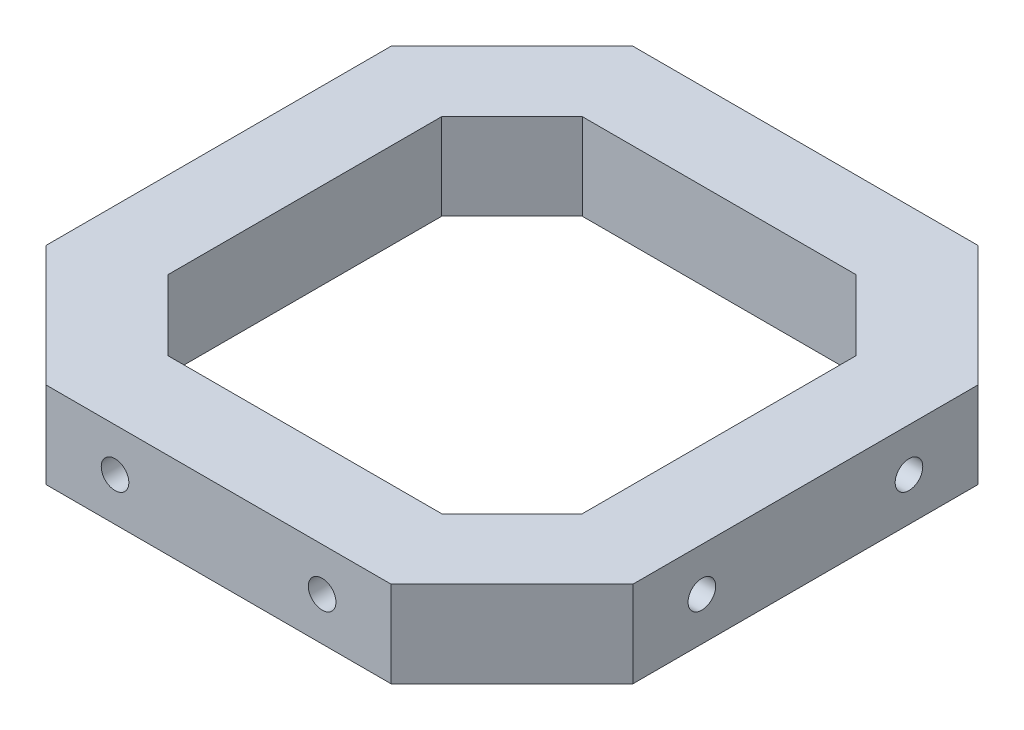
ISO-10303-21;
HEADER;
FILE_DESCRIPTION(('STEP AP214'),'2;1');
FILE_NAME('part.step','',(''),(''),'','','');
FILE_SCHEMA(('AUTOMOTIVE_DESIGN { 1 0 10303 214 1 1 1 1 }'));
ENDSEC;
DATA;
#1=APPLICATION_CONTEXT('core data for automotive mechanical design processes');
#2=APPLICATION_PROTOCOL_DEFINITION('international standard','automotive_design',2000,#1);
#3=PRODUCT_CONTEXT('',#1,'mechanical');
#4=PRODUCT('Part','Part','',(#3));
#5=PRODUCT_RELATED_PRODUCT_CATEGORY('part','',(#4));
#6=PRODUCT_DEFINITION_FORMATION('','',#4);
#7=PRODUCT_DEFINITION_CONTEXT('part definition',#1,'design');
#8=PRODUCT_DEFINITION('design','',#6,#7);
#9=PRODUCT_DEFINITION_SHAPE('','',#8);
#10=(LENGTH_UNIT() NAMED_UNIT(*) SI_UNIT(.MILLI.,.METRE.));
#11=(NAMED_UNIT(*) PLANE_ANGLE_UNIT() SI_UNIT($,.RADIAN.));
#12=(NAMED_UNIT(*) SI_UNIT($,.STERADIAN.) SOLID_ANGLE_UNIT());
#13=UNCERTAINTY_MEASURE_WITH_UNIT(LENGTH_MEASURE(1.E-05),#10,'distance_accuracy_value','');
#14=(GEOMETRIC_REPRESENTATION_CONTEXT(3) GLOBAL_UNCERTAINTY_ASSIGNED_CONTEXT((#13)) GLOBAL_UNIT_ASSIGNED_CONTEXT((#10,
#11,#12)) REPRESENTATION_CONTEXT('',''));
#15=CARTESIAN_POINT('',(0.,0.,0.));
#16=DIRECTION('',(0.,0.,1.));
#17=DIRECTION('',(1.,0.,0.));
#18=AXIS2_PLACEMENT_3D('',#15,#16,#17);
#19=CARTESIAN_POINT('',(0.,5.,0.));
#20=DIRECTION('',(0.,1.,0.));
#21=DIRECTION('',(0.,0.,1.));
#22=AXIS2_PLACEMENT_3D('',#19,#20,#21);
#23=PLANE('',#22);
#24=DIRECTION('',(0.,0.,1.));
#25=VECTOR('',#24,1.);
#26=CARTESIAN_POINT('',(17.,5.,-10.));
#27=LINE('',#26,#25);
#28=CARTESIAN_POINT('',(17.,5.,-10.));
#29=VERTEX_POINT('',#28);
#30=CARTESIAN_POINT('',(17.,5.,10.));
#31=VERTEX_POINT('',#30);
#32=EDGE_CURVE('E264',#29,#31,#27,.T.);
#33=ORIENTED_EDGE('',*,*,#32,.F.);
#34=DIRECTION('',(-0.707106781186547,0.,-0.707106781186548));
#35=VECTOR('',#34,1.);
#36=CARTESIAN_POINT('',(17.,5.,-10.));
#37=LINE('',#36,#35);
#38=CARTESIAN_POINT('',(10.,5.,-17.));
#39=VERTEX_POINT('',#38);
#40=EDGE_CURVE('E281',#29,#39,#37,.T.);
#41=ORIENTED_EDGE('',*,*,#40,.T.);
#42=DIRECTION('',(-1.,0.,0.));
#43=VECTOR('',#42,1.);
#44=CARTESIAN_POINT('',(10.,5.,-17.));
#45=LINE('',#44,#43);
#46=CARTESIAN_POINT('',(-10.,5.,-17.));
#47=VERTEX_POINT('',#46);
#48=EDGE_CURVE('E279',#39,#47,#45,.T.);
#49=ORIENTED_EDGE('',*,*,#48,.T.);
#50=DIRECTION('',(-0.707106781186547,0.,0.707106781186547));
#51=VECTOR('',#50,1.);
#52=CARTESIAN_POINT('',(-10.,5.,-17.));
#53=LINE('',#52,#51);
#54=CARTESIAN_POINT('',(-17.,5.,-10.));
#55=VERTEX_POINT('',#54);
#56=EDGE_CURVE('E277',#47,#55,#53,.T.);
#57=ORIENTED_EDGE('',*,*,#56,.T.);
#58=DIRECTION('',(0.,0.,1.));
#59=VECTOR('',#58,1.);
#60=CARTESIAN_POINT('',(-17.,5.,-10.));
#61=LINE('',#60,#59);
#62=CARTESIAN_POINT('',(-17.,5.,10.));
#63=VERTEX_POINT('',#62);
#64=EDGE_CURVE('E275',#55,#63,#61,.T.);
#65=ORIENTED_EDGE('',*,*,#64,.T.);
#66=DIRECTION('',(0.707106781186547,0.,0.707106781186547));
#67=VECTOR('',#66,1.);
#68=CARTESIAN_POINT('',(-17.,5.,10.));
#69=LINE('',#68,#67);
#70=CARTESIAN_POINT('',(-10.,5.,17.));
#71=VERTEX_POINT('',#70);
#72=EDGE_CURVE('E273',#63,#71,#69,.T.);
#73=ORIENTED_EDGE('',*,*,#72,.T.);
#74=DIRECTION('',(1.,0.,0.));
#75=VECTOR('',#74,1.);
#76=CARTESIAN_POINT('',(-10.,5.,17.));
#77=LINE('',#76,#75);
#78=CARTESIAN_POINT('',(10.,5.,17.));
#79=VERTEX_POINT('',#78);
#80=EDGE_CURVE('E271',#71,#79,#77,.T.);
#81=ORIENTED_EDGE('',*,*,#80,.T.);
#82=DIRECTION('',(-0.707106781186547,0.,0.707106781186548));
#83=VECTOR('',#82,1.);
#84=CARTESIAN_POINT('',(17.,5.,10.));
#85=LINE('',#84,#83);
#86=EDGE_CURVE('E267',#31,#79,#85,.T.);
#87=ORIENTED_EDGE('',*,*,#86,.F.);
#88=EDGE_LOOP('',(#33,#41,#49,#57,#65,#73,#81,#87));
#89=FACE_BOUND('',#88,.T.);
#90=DIRECTION('',(1.,0.,0.));
#91=VECTOR('',#90,1.);
#92=CARTESIAN_POINT('',(-7.92893218813452,5.,12.));
#93=LINE('',#92,#91);
#94=CARTESIAN_POINT('',(-7.92893218813452,5.,12.));
#95=VERTEX_POINT('',#94);
#96=CARTESIAN_POINT('',(7.9289321881345,5.,12.));
#97=VERTEX_POINT('',#96);
#98=EDGE_CURVE('E205',#95,#97,#93,.T.);
#99=ORIENTED_EDGE('',*,*,#98,.F.);
#100=DIRECTION('',(0.707106781186546,0.,0.707106781186549));
#101=VECTOR('',#100,1.);
#102=CARTESIAN_POINT('',(-12.,5.,7.92893218813448));
#103=LINE('',#102,#101);
#104=CARTESIAN_POINT('',(-12.,5.,7.92893218813448));
#105=VERTEX_POINT('',#104);
#106=EDGE_CURVE('E197',#105,#95,#103,.T.);
#107=ORIENTED_EDGE('',*,*,#106,.F.);
#108=DIRECTION('',(0.,0.,1.));
#109=VECTOR('',#108,1.);
#110=CARTESIAN_POINT('',(-12.,5.,-7.92893218813449));
#111=LINE('',#110,#109);
#112=CARTESIAN_POINT('',(-12.,5.,-7.92893218813449));
#113=VERTEX_POINT('',#112);
#114=EDGE_CURVE('E231',#113,#105,#111,.T.);
#115=ORIENTED_EDGE('',*,*,#114,.F.);
#116=DIRECTION('',(-0.707106781186544,0.,0.707106781186551));
#117=VECTOR('',#116,1.);
#118=CARTESIAN_POINT('',(-7.92893218813455,5.,-12.));
#119=LINE('',#118,#117);
#120=CARTESIAN_POINT('',(-7.92893218813455,5.,-12.));
#121=VERTEX_POINT('',#120);
#122=EDGE_CURVE('E229',#121,#113,#119,.T.);
#123=ORIENTED_EDGE('',*,*,#122,.F.);
#124=DIRECTION('',(-1.,0.,0.));
#125=VECTOR('',#124,1.);
#126=CARTESIAN_POINT('',(7.92893218813451,5.,-12.));
#127=LINE('',#126,#125);
#128=CARTESIAN_POINT('',(7.92893218813451,5.,-12.));
#129=VERTEX_POINT('',#128);
#130=EDGE_CURVE('E227',#129,#121,#127,.T.);
#131=ORIENTED_EDGE('',*,*,#130,.F.);
#132=DIRECTION('',(-0.707106781186546,0.,-0.707106781186549));
#133=VECTOR('',#132,1.);
#134=CARTESIAN_POINT('',(12.,5.,-7.92893218813449));
#135=LINE('',#134,#133);
#136=CARTESIAN_POINT('',(12.,5.,-7.92893218813449));
#137=VERTEX_POINT('',#136);
#138=EDGE_CURVE('E225',#137,#129,#135,.T.);
#139=ORIENTED_EDGE('',*,*,#138,.F.);
#140=DIRECTION('',(0.,0.,-1.));
#141=VECTOR('',#140,1.);
#142=CARTESIAN_POINT('',(12.,5.,7.92893218813451));
#143=LINE('',#142,#141);
#144=CARTESIAN_POINT('',(12.,5.,7.92893218813451));
#145=VERTEX_POINT('',#144);
#146=EDGE_CURVE('E220',#145,#137,#143,.T.);
#147=ORIENTED_EDGE('',*,*,#146,.F.);
#148=DIRECTION('',(0.707106781186548,0.,-0.707106781186547));
#149=VECTOR('',#148,1.);
#150=CARTESIAN_POINT('',(7.9289321881345,5.,12.));
#151=LINE('',#150,#149);
#152=EDGE_CURVE('E218',#97,#145,#151,.T.);
#153=ORIENTED_EDGE('',*,*,#152,.F.);
#154=EDGE_LOOP('',(#99,#107,#115,#123,#131,#139,#147,#153));
#155=FACE_BOUND('',#154,.T.);
#156=ADVANCED_FACE('F83',(#89,#155),#23,.T.);
#157=CARTESIAN_POINT('',(0.,0.,0.));
#158=DIRECTION('',(0.,1.,0.));
#159=DIRECTION('',(0.,0.,1.));
#160=AXIS2_PLACEMENT_3D('',#157,#158,#159);
#161=PLANE('',#160);
#162=DIRECTION('',(0.,0.,1.));
#163=VECTOR('',#162,1.);
#164=CARTESIAN_POINT('',(17.,0.,-10.));
#165=LINE('',#164,#163);
#166=CARTESIAN_POINT('',(17.,0.,-10.));
#167=VERTEX_POINT('',#166);
#168=CARTESIAN_POINT('',(17.,0.,10.));
#169=VERTEX_POINT('',#168);
#170=EDGE_CURVE('E213',#167,#169,#165,.T.);
#171=ORIENTED_EDGE('',*,*,#170,.T.);
#172=DIRECTION('',(-0.707106781186547,0.,0.707106781186548));
#173=VECTOR('',#172,1.);
#174=CARTESIAN_POINT('',(17.,0.,10.));
#175=LINE('',#174,#173);
#176=CARTESIAN_POINT('',(10.,0.,17.));
#177=VERTEX_POINT('',#176);
#178=EDGE_CURVE('E285',#169,#177,#175,.T.);
#179=ORIENTED_EDGE('',*,*,#178,.T.);
#180=DIRECTION('',(1.,0.,0.));
#181=VECTOR('',#180,1.);
#182=CARTESIAN_POINT('',(-10.,0.,17.));
#183=LINE('',#182,#181);
#184=CARTESIAN_POINT('',(-10.,0.,17.));
#185=VERTEX_POINT('',#184);
#186=EDGE_CURVE('E288',#185,#177,#183,.T.);
#187=ORIENTED_EDGE('',*,*,#186,.F.);
#188=DIRECTION('',(0.707106781186547,0.,0.707106781186547));
#189=VECTOR('',#188,1.);
#190=CARTESIAN_POINT('',(-17.,0.,10.));
#191=LINE('',#190,#189);
#192=CARTESIAN_POINT('',(-17.,0.,10.));
#193=VERTEX_POINT('',#192);
#194=EDGE_CURVE('E291',#193,#185,#191,.T.);
#195=ORIENTED_EDGE('',*,*,#194,.F.);
#196=DIRECTION('',(0.,0.,1.));
#197=VECTOR('',#196,1.);
#198=CARTESIAN_POINT('',(-17.,0.,-10.));
#199=LINE('',#198,#197);
#200=CARTESIAN_POINT('',(-17.,0.,-10.));
#201=VERTEX_POINT('',#200);
#202=EDGE_CURVE('E293',#201,#193,#199,.T.);
#203=ORIENTED_EDGE('',*,*,#202,.F.);
#204=DIRECTION('',(-0.707106781186547,0.,0.707106781186547));
#205=VECTOR('',#204,1.);
#206=CARTESIAN_POINT('',(-10.,0.,-17.));
#207=LINE('',#206,#205);
#208=CARTESIAN_POINT('',(-10.,0.,-17.));
#209=VERTEX_POINT('',#208);
#210=EDGE_CURVE('E295',#209,#201,#207,.T.);
#211=ORIENTED_EDGE('',*,*,#210,.F.);
#212=DIRECTION('',(-1.,0.,0.));
#213=VECTOR('',#212,1.);
#214=CARTESIAN_POINT('',(10.,0.,-17.));
#215=LINE('',#214,#213);
#216=CARTESIAN_POINT('',(10.,0.,-17.));
#217=VERTEX_POINT('',#216);
#218=EDGE_CURVE('E297',#217,#209,#215,.T.);
#219=ORIENTED_EDGE('',*,*,#218,.F.);
#220=DIRECTION('',(-0.707106781186547,0.,-0.707106781186548));
#221=VECTOR('',#220,1.);
#222=CARTESIAN_POINT('',(17.,0.,-10.));
#223=LINE('',#222,#221);
#224=EDGE_CURVE('E268',#167,#217,#223,.T.);
#225=ORIENTED_EDGE('',*,*,#224,.F.);
#226=EDGE_LOOP('',(#171,#179,#187,#195,#203,#211,#219,#225));
#227=FACE_BOUND('',#226,.T.);
#228=DIRECTION('',(0.707106781186546,0.,0.707106781186549));
#229=VECTOR('',#228,1.);
#230=CARTESIAN_POINT('',(-12.,0.,7.92893218813448));
#231=LINE('',#230,#229);
#232=CARTESIAN_POINT('',(-12.,0.,7.92893218813448));
#233=VERTEX_POINT('',#232);
#234=CARTESIAN_POINT('',(-7.92893218813452,0.,12.));
#235=VERTEX_POINT('',#234);
#236=EDGE_CURVE('E108',#233,#235,#231,.T.);
#237=ORIENTED_EDGE('',*,*,#236,.T.);
#238=DIRECTION('',(1.,0.,0.));
#239=VECTOR('',#238,1.);
#240=CARTESIAN_POINT('',(-7.92893218813452,0.,12.));
#241=LINE('',#240,#239);
#242=CARTESIAN_POINT('',(7.9289321881345,0.,12.));
#243=VERTEX_POINT('',#242);
#244=EDGE_CURVE('E212',#235,#243,#241,.T.);
#245=ORIENTED_EDGE('',*,*,#244,.T.);
#246=DIRECTION('',(0.707106781186548,0.,-0.707106781186547));
#247=VECTOR('',#246,1.);
#248=CARTESIAN_POINT('',(7.9289321881345,0.,12.));
#249=LINE('',#248,#247);
#250=CARTESIAN_POINT('',(12.,0.,7.92893218813451));
#251=VERTEX_POINT('',#250);
#252=EDGE_CURVE('E236',#243,#251,#249,.T.);
#253=ORIENTED_EDGE('',*,*,#252,.T.);
#254=DIRECTION('',(0.,0.,-1.));
#255=VECTOR('',#254,1.);
#256=CARTESIAN_POINT('',(12.,0.,7.92893218813451));
#257=LINE('',#256,#255);
#258=CARTESIAN_POINT('',(12.,0.,-7.92893218813449));
#259=VERTEX_POINT('',#258);
#260=EDGE_CURVE('E239',#251,#259,#257,.T.);
#261=ORIENTED_EDGE('',*,*,#260,.T.);
#262=DIRECTION('',(-0.707106781186546,0.,-0.707106781186549));
#263=VECTOR('',#262,1.);
#264=CARTESIAN_POINT('',(12.,0.,-7.92893218813449));
#265=LINE('',#264,#263);
#266=CARTESIAN_POINT('',(7.92893218813451,0.,-12.));
#267=VERTEX_POINT('',#266);
#268=EDGE_CURVE('E242',#259,#267,#265,.T.);
#269=ORIENTED_EDGE('',*,*,#268,.T.);
#270=DIRECTION('',(-1.,0.,0.));
#271=VECTOR('',#270,1.);
#272=CARTESIAN_POINT('',(7.92893218813451,0.,-12.));
#273=LINE('',#272,#271);
#274=CARTESIAN_POINT('',(-7.92893218813455,0.,-12.));
#275=VERTEX_POINT('',#274);
#276=EDGE_CURVE('E245',#267,#275,#273,.T.);
#277=ORIENTED_EDGE('',*,*,#276,.T.);
#278=DIRECTION('',(-0.707106781186544,0.,0.707106781186551));
#279=VECTOR('',#278,1.);
#280=CARTESIAN_POINT('',(-7.92893218813455,0.,-12.));
#281=LINE('',#280,#279);
#282=CARTESIAN_POINT('',(-12.,0.,-7.92893218813449));
#283=VERTEX_POINT('',#282);
#284=EDGE_CURVE('E248',#275,#283,#281,.T.);
#285=ORIENTED_EDGE('',*,*,#284,.T.);
#286=DIRECTION('',(0.,0.,1.));
#287=VECTOR('',#286,1.);
#288=CARTESIAN_POINT('',(-12.,0.,-7.92893218813449));
#289=LINE('',#288,#287);
#290=EDGE_CURVE('E206',#283,#233,#289,.T.);
#291=ORIENTED_EDGE('',*,*,#290,.T.);
#292=EDGE_LOOP('',(#237,#245,#253,#261,#269,#277,#285,#291));
#293=FACE_BOUND('',#292,.T.);
#294=ADVANCED_FACE('F325',(#227,#293),#161,.F.);
#295=CARTESIAN_POINT('',(17.,5.,-10.));
#296=DIRECTION('',(1.,0.,0.));
#297=DIRECTION('',(0.,0.,-1.));
#298=AXIS2_PLACEMENT_3D('',#295,#296,#297);
#299=PLANE('',#298);
#300=CARTESIAN_POINT('',(17.,2.5,-6.));
#301=DIRECTION('',(1.,0.,0.));
#302=DIRECTION('',(0.,0.,-1.));
#303=AXIS2_PLACEMENT_3D('',#300,#301,#302);
#304=CIRCLE('',#303,0.800000000000001);
#305=CARTESIAN_POINT('',(17.,2.5,-6.8));
#306=VERTEX_POINT('',#305);
#307=EDGE_CURVE('E384',#306,#306,#304,.T.);
#308=ORIENTED_EDGE('',*,*,#307,.F.);
#309=EDGE_LOOP('',(#308));
#310=FACE_BOUND('',#309,.T.);
#311=CARTESIAN_POINT('',(17.,2.5,6.));
#312=DIRECTION('',(1.,0.,0.));
#313=DIRECTION('',(0.,0.,-1.));
#314=AXIS2_PLACEMENT_3D('',#311,#312,#313);
#315=CIRCLE('',#314,0.800000000000001);
#316=CARTESIAN_POINT('',(17.,2.5,5.2));
#317=VERTEX_POINT('',#316);
#318=EDGE_CURVE('E387',#317,#317,#315,.T.);
#319=ORIENTED_EDGE('',*,*,#318,.F.);
#320=EDGE_LOOP('',(#319));
#321=FACE_BOUND('',#320,.T.);
#322=ORIENTED_EDGE('',*,*,#170,.F.);
#323=DIRECTION('',(0.,-1.,0.));
#324=VECTOR('',#323,1.);
#325=CARTESIAN_POINT('',(17.,5.,-10.));
#326=LINE('',#325,#324);
#327=EDGE_CURVE('E12',#29,#167,#326,.T.);
#328=ORIENTED_EDGE('',*,*,#327,.F.);
#329=ORIENTED_EDGE('',*,*,#32,.T.);
#330=DIRECTION('',(0.,-1.,0.));
#331=VECTOR('',#330,1.);
#332=CARTESIAN_POINT('',(17.,5.,10.));
#333=LINE('',#332,#331);
#334=EDGE_CURVE('E87',#31,#169,#333,.T.);
#335=ORIENTED_EDGE('',*,*,#334,.T.);
#336=EDGE_LOOP('',(#322,#328,#329,#335));
#337=FACE_BOUND('',#336,.T.);
#338=ADVANCED_FACE('F85',(#310,#321,#337),#299,.T.);
#339=CARTESIAN_POINT('',(17.,5.,-10.));
#340=DIRECTION('',(-0.707106781186548,0.,0.707106781186547));
#341=DIRECTION('',(0.707106781186547,0.,0.707106781186548));
#342=AXIS2_PLACEMENT_3D('',#339,#340,#341);
#343=PLANE('',#342);
#344=ORIENTED_EDGE('',*,*,#224,.T.);
#345=DIRECTION('',(0.,-1.,0.));
#346=VECTOR('',#345,1.);
#347=CARTESIAN_POINT('',(10.,5.,-17.));
#348=LINE('',#347,#346);
#349=EDGE_CURVE('E92',#39,#217,#348,.T.);
#350=ORIENTED_EDGE('',*,*,#349,.F.);
#351=ORIENTED_EDGE('',*,*,#40,.F.);
#352=ORIENTED_EDGE('',*,*,#327,.T.);
#353=EDGE_LOOP('',(#344,#350,#351,#352));
#354=FACE_BOUND('',#353,.T.);
#355=ADVANCED_FACE('F331',(#354),#343,.F.);
#356=CARTESIAN_POINT('',(10.,5.,-17.));
#357=DIRECTION('',(0.,0.,1.));
#358=DIRECTION('',(1.,0.,0.));
#359=AXIS2_PLACEMENT_3D('',#356,#357,#358);
#360=PLANE('',#359);
#361=CARTESIAN_POINT('',(-6.,2.5,-17.));
#362=DIRECTION('',(0.,0.,-1.));
#363=DIRECTION('',(-1.,0.,0.));
#364=AXIS2_PLACEMENT_3D('',#361,#362,#363);
#365=CIRCLE('',#364,0.800000000000001);
#366=CARTESIAN_POINT('',(-6.8,2.5,-17.));
#367=VERTEX_POINT('',#366);
#368=EDGE_CURVE('E423',#367,#367,#365,.T.);
#369=ORIENTED_EDGE('',*,*,#368,.F.);
#370=EDGE_LOOP('',(#369));
#371=FACE_BOUND('',#370,.T.);
#372=CARTESIAN_POINT('',(6.,2.5,-17.));
#373=DIRECTION('',(0.,0.,-1.));
#374=DIRECTION('',(-1.,0.,0.));
#375=AXIS2_PLACEMENT_3D('',#372,#373,#374);
#376=CIRCLE('',#375,0.800000000000001);
#377=CARTESIAN_POINT('',(5.2,2.5,-17.));
#378=VERTEX_POINT('',#377);
#379=EDGE_CURVE('E426',#378,#378,#376,.T.);
#380=ORIENTED_EDGE('',*,*,#379,.F.);
#381=EDGE_LOOP('',(#380));
#382=FACE_BOUND('',#381,.T.);
#383=ORIENTED_EDGE('',*,*,#218,.T.);
#384=DIRECTION('',(0.,-1.,0.));
#385=VECTOR('',#384,1.);
#386=CARTESIAN_POINT('',(-10.,5.,-17.));
#387=LINE('',#386,#385);
#388=EDGE_CURVE('E302',#47,#209,#387,.T.);
#389=ORIENTED_EDGE('',*,*,#388,.F.);
#390=ORIENTED_EDGE('',*,*,#48,.F.);
#391=ORIENTED_EDGE('',*,*,#349,.T.);
#392=EDGE_LOOP('',(#383,#389,#390,#391));
#393=FACE_BOUND('',#392,.T.);
#394=ADVANCED_FACE('F335',(#371,#382,#393),#360,.F.);
#395=CARTESIAN_POINT('',(-10.,5.,-17.));
#396=DIRECTION('',(0.707106781186548,0.,0.707106781186548));
#397=DIRECTION('',(0.707106781186548,0.,-0.707106781186548));
#398=AXIS2_PLACEMENT_3D('',#395,#396,#397);
#399=PLANE('',#398);
#400=ORIENTED_EDGE('',*,*,#210,.T.);
#401=DIRECTION('',(0.,-1.,0.));
#402=VECTOR('',#401,1.);
#403=CARTESIAN_POINT('',(-17.,5.,-10.));
#404=LINE('',#403,#402);
#405=EDGE_CURVE('E305',#55,#201,#404,.T.);
#406=ORIENTED_EDGE('',*,*,#405,.F.);
#407=ORIENTED_EDGE('',*,*,#56,.F.);
#408=ORIENTED_EDGE('',*,*,#388,.T.);
#409=EDGE_LOOP('',(#400,#406,#407,#408));
#410=FACE_BOUND('',#409,.T.);
#411=ADVANCED_FACE('F354',(#410),#399,.F.);
#412=CARTESIAN_POINT('',(-17.,5.,-10.));
#413=DIRECTION('',(1.,0.,0.));
#414=DIRECTION('',(0.,0.,-1.));
#415=AXIS2_PLACEMENT_3D('',#412,#413,#414);
#416=PLANE('',#415);
#417=CARTESIAN_POINT('',(-17.,2.5,-6.));
#418=DIRECTION('',(-1.,0.,0.));
#419=DIRECTION('',(0.,0.,1.));
#420=AXIS2_PLACEMENT_3D('',#417,#418,#419);
#421=CIRCLE('',#420,0.800000000000001);
#422=CARTESIAN_POINT('',(-17.,2.5,-5.2));
#423=VERTEX_POINT('',#422);
#424=EDGE_CURVE('E399',#423,#423,#421,.T.);
#425=ORIENTED_EDGE('',*,*,#424,.F.);
#426=EDGE_LOOP('',(#425));
#427=FACE_BOUND('',#426,.T.);
#428=CARTESIAN_POINT('',(-17.,2.5,6.));
#429=DIRECTION('',(-1.,0.,0.));
#430=DIRECTION('',(0.,0.,1.));
#431=AXIS2_PLACEMENT_3D('',#428,#429,#430);
#432=CIRCLE('',#431,0.800000000000001);
#433=CARTESIAN_POINT('',(-17.,2.5,6.8));
#434=VERTEX_POINT('',#433);
#435=EDGE_CURVE('E405',#434,#434,#432,.T.);
#436=ORIENTED_EDGE('',*,*,#435,.F.);
#437=EDGE_LOOP('',(#436));
#438=FACE_BOUND('',#437,.T.);
#439=ORIENTED_EDGE('',*,*,#202,.T.);
#440=DIRECTION('',(0.,-1.,0.));
#441=VECTOR('',#440,1.);
#442=CARTESIAN_POINT('',(-17.,5.,10.));
#443=LINE('',#442,#441);
#444=EDGE_CURVE('E308',#63,#193,#443,.T.);
#445=ORIENTED_EDGE('',*,*,#444,.F.);
#446=ORIENTED_EDGE('',*,*,#64,.F.);
#447=ORIENTED_EDGE('',*,*,#405,.T.);
#448=EDGE_LOOP('',(#439,#445,#446,#447));
#449=FACE_BOUND('',#448,.T.);
#450=ADVANCED_FACE('F352',(#427,#438,#449),#416,.F.);
#451=CARTESIAN_POINT('',(-17.,5.,10.));
#452=DIRECTION('',(0.707106781186548,0.,-0.707106781186548));
#453=DIRECTION('',(-0.707106781186548,0.,-0.707106781186548));
#454=AXIS2_PLACEMENT_3D('',#451,#452,#453);
#455=PLANE('',#454);
#456=ORIENTED_EDGE('',*,*,#194,.T.);
#457=DIRECTION('',(0.,-1.,0.));
#458=VECTOR('',#457,1.);
#459=CARTESIAN_POINT('',(-10.,5.,17.));
#460=LINE('',#459,#458);
#461=EDGE_CURVE('E311',#71,#185,#460,.T.);
#462=ORIENTED_EDGE('',*,*,#461,.F.);
#463=ORIENTED_EDGE('',*,*,#72,.F.);
#464=ORIENTED_EDGE('',*,*,#444,.T.);
#465=EDGE_LOOP('',(#456,#462,#463,#464));
#466=FACE_BOUND('',#465,.T.);
#467=ADVANCED_FACE('F348',(#466),#455,.F.);
#468=CARTESIAN_POINT('',(-10.,5.,17.));
#469=DIRECTION('',(0.,0.,-1.));
#470=DIRECTION('',(-1.,0.,0.));
#471=AXIS2_PLACEMENT_3D('',#468,#469,#470);
#472=PLANE('',#471);
#473=CARTESIAN_POINT('',(-6.,2.5,17.));
#474=DIRECTION('',(0.,0.,-1.));
#475=DIRECTION('',(-1.,0.,0.));
#476=AXIS2_PLACEMENT_3D('',#473,#474,#475);
#477=CIRCLE('',#476,0.800000000000001);
#478=CARTESIAN_POINT('',(-6.8,2.5,17.));
#479=VERTEX_POINT('',#478);
#480=EDGE_CURVE('E413',#479,#479,#477,.T.);
#481=ORIENTED_EDGE('',*,*,#480,.T.);
#482=EDGE_LOOP('',(#481));
#483=FACE_BOUND('',#482,.T.);
#484=CARTESIAN_POINT('',(6.,2.5,17.));
#485=DIRECTION('',(0.,0.,-1.));
#486=DIRECTION('',(-1.,0.,0.));
#487=AXIS2_PLACEMENT_3D('',#484,#485,#486);
#488=CIRCLE('',#487,0.800000000000001);
#489=CARTESIAN_POINT('',(5.2,2.5,17.));
#490=VERTEX_POINT('',#489);
#491=EDGE_CURVE('E398',#490,#490,#488,.T.);
#492=ORIENTED_EDGE('',*,*,#491,.T.);
#493=EDGE_LOOP('',(#492));
#494=FACE_BOUND('',#493,.T.);
#495=ORIENTED_EDGE('',*,*,#186,.T.);
#496=DIRECTION('',(0.,-1.,0.));
#497=VECTOR('',#496,1.);
#498=CARTESIAN_POINT('',(10.,5.,17.));
#499=LINE('',#498,#497);
#500=EDGE_CURVE('E313',#79,#177,#499,.T.);
#501=ORIENTED_EDGE('',*,*,#500,.F.);
#502=ORIENTED_EDGE('',*,*,#80,.F.);
#503=ORIENTED_EDGE('',*,*,#461,.T.);
#504=EDGE_LOOP('',(#495,#501,#502,#503));
#505=FACE_BOUND('',#504,.T.);
#506=ADVANCED_FACE('F344',(#483,#494,#505),#472,.F.);
#507=CARTESIAN_POINT('',(17.,5.,10.));
#508=DIRECTION('',(0.707106781186548,0.,0.707106781186547));
#509=DIRECTION('',(0.707106781186547,0.,-0.707106781186548));
#510=AXIS2_PLACEMENT_3D('',#507,#508,#509);
#511=PLANE('',#510);
#512=ORIENTED_EDGE('',*,*,#178,.F.);
#513=ORIENTED_EDGE('',*,*,#334,.F.);
#514=ORIENTED_EDGE('',*,*,#86,.T.);
#515=ORIENTED_EDGE('',*,*,#500,.T.);
#516=EDGE_LOOP('',(#512,#513,#514,#515));
#517=FACE_BOUND('',#516,.T.);
#518=ADVANCED_FACE('F321',(#517),#511,.T.);
#519=CARTESIAN_POINT('',(-12.,5.,7.92893218813448));
#520=DIRECTION('',(0.707106781186549,0.,-0.707106781186546));
#521=DIRECTION('',(-0.707106781186546,0.,-0.707106781186549));
#522=AXIS2_PLACEMENT_3D('',#519,#520,#521);
#523=PLANE('',#522);
#524=ORIENTED_EDGE('',*,*,#236,.F.);
#525=DIRECTION('',(0.,-1.,0.));
#526=VECTOR('',#525,1.);
#527=CARTESIAN_POINT('',(-12.,5.,7.92893218813448));
#528=LINE('',#527,#526);
#529=EDGE_CURVE('E201',#105,#233,#528,.T.);
#530=ORIENTED_EDGE('',*,*,#529,.F.);
#531=ORIENTED_EDGE('',*,*,#106,.T.);
#532=DIRECTION('',(0.,-1.,0.));
#533=VECTOR('',#532,1.);
#534=CARTESIAN_POINT('',(-7.92893218813452,5.,12.));
#535=LINE('',#534,#533);
#536=EDGE_CURVE('E200',#95,#235,#535,.T.);
#537=ORIENTED_EDGE('',*,*,#536,.T.);
#538=EDGE_LOOP('',(#524,#530,#531,#537));
#539=FACE_BOUND('',#538,.T.);
#540=ADVANCED_FACE('F199',(#539),#523,.T.);
#541=CARTESIAN_POINT('',(-7.92893218813452,5.,12.));
#542=DIRECTION('',(0.,0.,-1.));
#543=DIRECTION('',(-1.,0.,0.));
#544=AXIS2_PLACEMENT_3D('',#541,#542,#543);
#545=PLANE('',#544);
#546=ORIENTED_EDGE('',*,*,#244,.F.);
#547=ORIENTED_EDGE('',*,*,#536,.F.);
#548=ORIENTED_EDGE('',*,*,#98,.T.);
#549=DIRECTION('',(0.,-1.,0.));
#550=VECTOR('',#549,1.);
#551=CARTESIAN_POINT('',(7.9289321881345,5.,12.));
#552=LINE('',#551,#550);
#553=EDGE_CURVE('E214',#97,#243,#552,.T.);
#554=ORIENTED_EDGE('',*,*,#553,.T.);
#555=EDGE_LOOP('',(#546,#547,#548,#554));
#556=FACE_BOUND('',#555,.T.);
#557=ADVANCED_FACE('F209',(#556),#545,.T.);
#558=CARTESIAN_POINT('',(7.9289321881345,5.,12.));
#559=DIRECTION('',(-0.707106781186547,0.,-0.707106781186548));
#560=DIRECTION('',(-0.707106781186548,0.,0.707106781186547));
#561=AXIS2_PLACEMENT_3D('',#558,#559,#560);
#562=PLANE('',#561);
#563=ORIENTED_EDGE('',*,*,#252,.F.);
#564=ORIENTED_EDGE('',*,*,#553,.F.);
#565=ORIENTED_EDGE('',*,*,#152,.T.);
#566=DIRECTION('',(0.,-1.,0.));
#567=VECTOR('',#566,1.);
#568=CARTESIAN_POINT('',(12.,5.,7.92893218813451));
#569=LINE('',#568,#567);
#570=EDGE_CURVE('E261',#145,#251,#569,.T.);
#571=ORIENTED_EDGE('',*,*,#570,.T.);
#572=EDGE_LOOP('',(#563,#564,#565,#571));
#573=FACE_BOUND('',#572,.T.);
#574=ADVANCED_FACE('F465',(#573),#562,.T.);
#575=CARTESIAN_POINT('',(12.,5.,7.92893218813451));
#576=DIRECTION('',(-1.,0.,0.));
#577=DIRECTION('',(0.,0.,1.));
#578=AXIS2_PLACEMENT_3D('',#575,#576,#577);
#579=PLANE('',#578);
#580=ORIENTED_EDGE('',*,*,#260,.F.);
#581=ORIENTED_EDGE('',*,*,#570,.F.);
#582=ORIENTED_EDGE('',*,*,#146,.T.);
#583=DIRECTION('',(0.,-1.,0.));
#584=VECTOR('',#583,1.);
#585=CARTESIAN_POINT('',(12.,5.,-7.92893218813449));
#586=LINE('',#585,#584);
#587=EDGE_CURVE('E259',#137,#259,#586,.T.);
#588=ORIENTED_EDGE('',*,*,#587,.T.);
#589=EDGE_LOOP('',(#580,#581,#582,#588));
#590=FACE_BOUND('',#589,.T.);
#591=ADVANCED_FACE('F461',(#590),#579,.T.);
#592=CARTESIAN_POINT('',(12.,5.,-7.92893218813449));
#593=DIRECTION('',(-0.707106781186549,0.,0.707106781186546));
#594=DIRECTION('',(0.707106781186546,0.,0.707106781186549));
#595=AXIS2_PLACEMENT_3D('',#592,#593,#594);
#596=PLANE('',#595);
#597=ORIENTED_EDGE('',*,*,#268,.F.);
#598=ORIENTED_EDGE('',*,*,#587,.F.);
#599=ORIENTED_EDGE('',*,*,#138,.T.);
#600=DIRECTION('',(0.,-1.,0.));
#601=VECTOR('',#600,1.);
#602=CARTESIAN_POINT('',(7.92893218813451,5.,-12.));
#603=LINE('',#602,#601);
#604=EDGE_CURVE('E257',#129,#267,#603,.T.);
#605=ORIENTED_EDGE('',*,*,#604,.T.);
#606=EDGE_LOOP('',(#597,#598,#599,#605));
#607=FACE_BOUND('',#606,.T.);
#608=ADVANCED_FACE('F457',(#607),#596,.T.);
#609=CARTESIAN_POINT('',(7.92893218813451,5.,-12.));
#610=DIRECTION('',(0.,0.,1.));
#611=DIRECTION('',(1.,0.,0.));
#612=AXIS2_PLACEMENT_3D('',#609,#610,#611);
#613=PLANE('',#612);
#614=ORIENTED_EDGE('',*,*,#276,.F.);
#615=ORIENTED_EDGE('',*,*,#604,.F.);
#616=ORIENTED_EDGE('',*,*,#130,.T.);
#617=DIRECTION('',(0.,-1.,0.));
#618=VECTOR('',#617,1.);
#619=CARTESIAN_POINT('',(-7.92893218813455,5.,-12.));
#620=LINE('',#619,#618);
#621=EDGE_CURVE('E255',#121,#275,#620,.T.);
#622=ORIENTED_EDGE('',*,*,#621,.T.);
#623=EDGE_LOOP('',(#614,#615,#616,#622));
#624=FACE_BOUND('',#623,.T.);
#625=ADVANCED_FACE('F453',(#624),#613,.T.);
#626=CARTESIAN_POINT('',(-7.92893218813455,5.,-12.));
#627=DIRECTION('',(0.707106781186551,0.,0.707106781186544));
#628=DIRECTION('',(0.707106781186544,0.,-0.707106781186551));
#629=AXIS2_PLACEMENT_3D('',#626,#627,#628);
#630=PLANE('',#629);
#631=ORIENTED_EDGE('',*,*,#284,.F.);
#632=ORIENTED_EDGE('',*,*,#621,.F.);
#633=ORIENTED_EDGE('',*,*,#122,.T.);
#634=DIRECTION('',(0.,-1.,0.));
#635=VECTOR('',#634,1.);
#636=CARTESIAN_POINT('',(-12.,5.,-7.92893218813449));
#637=LINE('',#636,#635);
#638=EDGE_CURVE('E100',#113,#283,#637,.T.);
#639=ORIENTED_EDGE('',*,*,#638,.T.);
#640=EDGE_LOOP('',(#631,#632,#633,#639));
#641=FACE_BOUND('',#640,.T.);
#642=ADVANCED_FACE('F446',(#641),#630,.T.);
#643=CARTESIAN_POINT('',(-12.,5.,-7.92893218813449));
#644=DIRECTION('',(1.,0.,0.));
#645=DIRECTION('',(0.,0.,-1.));
#646=AXIS2_PLACEMENT_3D('',#643,#644,#645);
#647=PLANE('',#646);
#648=ORIENTED_EDGE('',*,*,#290,.F.);
#649=ORIENTED_EDGE('',*,*,#638,.F.);
#650=ORIENTED_EDGE('',*,*,#114,.T.);
#651=ORIENTED_EDGE('',*,*,#529,.T.);
#652=EDGE_LOOP('',(#648,#649,#650,#651));
#653=FACE_BOUND('',#652,.T.);
#654=ADVANCED_FACE('F436',(#653),#647,.T.);
#655=CARTESIAN_POINT('',(6.,2.5,-14.));
#656=DIRECTION('',(0.,0.,-1.));
#657=DIRECTION('',(-1.,0.,0.));
#658=AXIS2_PLACEMENT_3D('',#655,#656,#657);
#659=CYLINDRICAL_SURFACE('',#658,0.800000000000001);
#660=CARTESIAN_POINT('',(6.,2.5,-14.));
#661=DIRECTION('',(0.,0.,-1.));
#662=DIRECTION('',(-1.,0.,0.));
#663=AXIS2_PLACEMENT_3D('',#660,#661,#662);
#664=CIRCLE('',#663,0.800000000000001);
#665=CARTESIAN_POINT('',(5.2,2.5,-14.));
#666=VERTEX_POINT('',#665);
#667=EDGE_CURVE('E412',#666,#666,#664,.T.);
#668=ORIENTED_EDGE('',*,*,#667,.F.);
#669=EDGE_LOOP('',(#668));
#670=FACE_BOUND('',#669,.T.);
#671=ORIENTED_EDGE('',*,*,#379,.T.);
#672=EDGE_LOOP('',(#671));
#673=FACE_BOUND('',#672,.T.);
#674=ADVANCED_FACE('F433',(#670,#673),#659,.F.);
#675=CARTESIAN_POINT('',(6.,2.5,-14.));
#676=DIRECTION('',(0.,0.,-1.));
#677=DIRECTION('',(-1.,0.,0.));
#678=AXIS2_PLACEMENT_3D('',#675,#676,#677);
#679=PLANE('',#678);
#680=ORIENTED_EDGE('',*,*,#667,.T.);
#681=EDGE_LOOP('',(#680));
#682=FACE_BOUND('',#681,.T.);
#683=ADVANCED_FACE('F431',(#682),#679,.T.);
#684=CARTESIAN_POINT('',(-6.,2.5,-14.));
#685=DIRECTION('',(0.,0.,-1.));
#686=DIRECTION('',(-1.,0.,0.));
#687=AXIS2_PLACEMENT_3D('',#684,#685,#686);
#688=CYLINDRICAL_SURFACE('',#687,0.800000000000001);
#689=CARTESIAN_POINT('',(-6.,2.5,-14.));
#690=DIRECTION('',(0.,0.,-1.));
#691=DIRECTION('',(-1.,0.,0.));
#692=AXIS2_PLACEMENT_3D('',#689,#690,#691);
#693=CIRCLE('',#692,0.800000000000001);
#694=CARTESIAN_POINT('',(-6.8,2.5,-14.));
#695=VERTEX_POINT('',#694);
#696=EDGE_CURVE('E234',#695,#695,#693,.T.);
#697=ORIENTED_EDGE('',*,*,#696,.F.);
#698=EDGE_LOOP('',(#697));
#699=FACE_BOUND('',#698,.T.);
#700=ORIENTED_EDGE('',*,*,#368,.T.);
#701=EDGE_LOOP('',(#700));
#702=FACE_BOUND('',#701,.T.);
#703=ADVANCED_FACE('F444',(#699,#702),#688,.F.);
#704=CARTESIAN_POINT('',(-6.,2.5,-14.));
#705=DIRECTION('',(0.,0.,-1.));
#706=DIRECTION('',(-1.,0.,0.));
#707=AXIS2_PLACEMENT_3D('',#704,#705,#706);
#708=PLANE('',#707);
#709=ORIENTED_EDGE('',*,*,#696,.T.);
#710=EDGE_LOOP('',(#709));
#711=FACE_BOUND('',#710,.T.);
#712=ADVANCED_FACE('F498',(#711),#708,.T.);
#713=CARTESIAN_POINT('',(6.,2.5,14.));
#714=DIRECTION('',(0.,0.,1.));
#715=DIRECTION('',(1.,0.,0.));
#716=AXIS2_PLACEMENT_3D('',#713,#714,#715);
#717=CYLINDRICAL_SURFACE('',#716,0.800000000000001);
#718=CARTESIAN_POINT('',(6.,2.5,14.));
#719=DIRECTION('',(0.,0.,-1.));
#720=DIRECTION('',(-1.,0.,0.));
#721=AXIS2_PLACEMENT_3D('',#718,#719,#720);
#722=CIRCLE('',#721,0.800000000000001);
#723=CARTESIAN_POINT('',(5.2,2.5,14.));
#724=VERTEX_POINT('',#723);
#725=EDGE_CURVE('E416',#724,#724,#722,.T.);
#726=ORIENTED_EDGE('',*,*,#725,.T.);
#727=EDGE_LOOP('',(#726));
#728=FACE_BOUND('',#727,.T.);
#729=ORIENTED_EDGE('',*,*,#491,.F.);
#730=EDGE_LOOP('',(#729));
#731=FACE_BOUND('',#730,.T.);
#732=ADVANCED_FACE('F503',(#728,#731),#717,.F.);
#733=CARTESIAN_POINT('',(6.,2.5,14.));
#734=DIRECTION('',(0.,0.,-1.));
#735=DIRECTION('',(-1.,0.,0.));
#736=AXIS2_PLACEMENT_3D('',#733,#734,#735);
#737=PLANE('',#736);
#738=ORIENTED_EDGE('',*,*,#725,.F.);
#739=EDGE_LOOP('',(#738));
#740=FACE_BOUND('',#739,.T.);
#741=ADVANCED_FACE('F508',(#740),#737,.F.);
#742=CARTESIAN_POINT('',(-6.,2.5,14.));
#743=DIRECTION('',(0.,0.,1.));
#744=DIRECTION('',(1.,0.,0.));
#745=AXIS2_PLACEMENT_3D('',#742,#743,#744);
#746=CYLINDRICAL_SURFACE('',#745,0.800000000000001);
#747=CARTESIAN_POINT('',(-6.,2.5,14.));
#748=DIRECTION('',(0.,0.,-1.));
#749=DIRECTION('',(-1.,0.,0.));
#750=AXIS2_PLACEMENT_3D('',#747,#748,#749);
#751=CIRCLE('',#750,0.800000000000001);
#752=CARTESIAN_POINT('',(-6.8,2.5,14.));
#753=VERTEX_POINT('',#752);
#754=EDGE_CURVE('E409',#753,#753,#751,.T.);
#755=ORIENTED_EDGE('',*,*,#754,.T.);
#756=EDGE_LOOP('',(#755));
#757=FACE_BOUND('',#756,.T.);
#758=ORIENTED_EDGE('',*,*,#480,.F.);
#759=EDGE_LOOP('',(#758));
#760=FACE_BOUND('',#759,.T.);
#761=ADVANCED_FACE('F518',(#757,#760),#746,.F.);
#762=CARTESIAN_POINT('',(-6.,2.5,14.));
#763=DIRECTION('',(0.,0.,-1.));
#764=DIRECTION('',(-1.,0.,0.));
#765=AXIS2_PLACEMENT_3D('',#762,#763,#764);
#766=PLANE('',#765);
#767=ORIENTED_EDGE('',*,*,#754,.F.);
#768=EDGE_LOOP('',(#767));
#769=FACE_BOUND('',#768,.T.);
#770=ADVANCED_FACE('F528',(#769),#766,.F.);
#771=CARTESIAN_POINT('',(-14.,2.5,6.));
#772=DIRECTION('',(-1.,0.,0.));
#773=DIRECTION('',(0.,0.,1.));
#774=AXIS2_PLACEMENT_3D('',#771,#772,#773);
#775=CYLINDRICAL_SURFACE('',#774,0.800000000000001);
#776=CARTESIAN_POINT('',(-14.,2.5,6.));
#777=DIRECTION('',(-1.,0.,0.));
#778=DIRECTION('',(0.,0.,1.));
#779=AXIS2_PLACEMENT_3D('',#776,#777,#778);
#780=CIRCLE('',#779,0.800000000000001);
#781=CARTESIAN_POINT('',(-14.,2.5,6.8));
#782=VERTEX_POINT('',#781);
#783=EDGE_CURVE('E402',#782,#782,#780,.T.);
#784=ORIENTED_EDGE('',*,*,#783,.F.);
#785=EDGE_LOOP('',(#784));
#786=FACE_BOUND('',#785,.T.);
#787=ORIENTED_EDGE('',*,*,#435,.T.);
#788=EDGE_LOOP('',(#787));
#789=FACE_BOUND('',#788,.T.);
#790=ADVANCED_FACE('F537',(#786,#789),#775,.F.);
#791=CARTESIAN_POINT('',(-14.,2.5,6.));
#792=DIRECTION('',(-1.,0.,0.));
#793=DIRECTION('',(0.,0.,1.));
#794=AXIS2_PLACEMENT_3D('',#791,#792,#793);
#795=PLANE('',#794);
#796=ORIENTED_EDGE('',*,*,#783,.T.);
#797=EDGE_LOOP('',(#796));
#798=FACE_BOUND('',#797,.T.);
#799=ADVANCED_FACE('F553',(#798),#795,.T.);
#800=CARTESIAN_POINT('',(-14.,2.5,-6.));
#801=DIRECTION('',(-1.,0.,0.));
#802=DIRECTION('',(0.,0.,1.));
#803=AXIS2_PLACEMENT_3D('',#800,#801,#802);
#804=CYLINDRICAL_SURFACE('',#803,0.800000000000001);
#805=CARTESIAN_POINT('',(-14.,2.5,-6.));
#806=DIRECTION('',(-1.,0.,0.));
#807=DIRECTION('',(0.,0.,1.));
#808=AXIS2_PLACEMENT_3D('',#805,#806,#807);
#809=CIRCLE('',#808,0.800000000000001);
#810=CARTESIAN_POINT('',(-14.,2.5,-5.2));
#811=VERTEX_POINT('',#810);
#812=EDGE_CURVE('E395',#811,#811,#809,.T.);
#813=ORIENTED_EDGE('',*,*,#812,.F.);
#814=EDGE_LOOP('',(#813));
#815=FACE_BOUND('',#814,.T.);
#816=ORIENTED_EDGE('',*,*,#424,.T.);
#817=EDGE_LOOP('',(#816));
#818=FACE_BOUND('',#817,.T.);
#819=ADVANCED_FACE('F563',(#815,#818),#804,.F.);
#820=CARTESIAN_POINT('',(-14.,2.5,-6.));
#821=DIRECTION('',(-1.,0.,0.));
#822=DIRECTION('',(0.,0.,1.));
#823=AXIS2_PLACEMENT_3D('',#820,#821,#822);
#824=PLANE('',#823);
#825=ORIENTED_EDGE('',*,*,#812,.T.);
#826=EDGE_LOOP('',(#825));
#827=FACE_BOUND('',#826,.T.);
#828=ADVANCED_FACE('F573',(#827),#824,.T.);
#829=CARTESIAN_POINT('',(14.,2.5,6.));
#830=DIRECTION('',(1.,0.,0.));
#831=DIRECTION('',(0.,0.,-1.));
#832=AXIS2_PLACEMENT_3D('',#829,#830,#831);
#833=CYLINDRICAL_SURFACE('',#832,0.800000000000001);
#834=CARTESIAN_POINT('',(14.,2.5,6.));
#835=DIRECTION('',(1.,0.,0.));
#836=DIRECTION('',(0.,0.,-1.));
#837=AXIS2_PLACEMENT_3D('',#834,#835,#836);
#838=CIRCLE('',#837,0.800000000000001);
#839=CARTESIAN_POINT('',(14.,2.5,5.2));
#840=VERTEX_POINT('',#839);
#841=EDGE_CURVE('E389',#840,#840,#838,.T.);
#842=ORIENTED_EDGE('',*,*,#841,.F.);
#843=EDGE_LOOP('',(#842));
#844=FACE_BOUND('',#843,.T.);
#845=ORIENTED_EDGE('',*,*,#318,.T.);
#846=EDGE_LOOP('',(#845));
#847=FACE_BOUND('',#846,.T.);
#848=ADVANCED_FACE('F582',(#844,#847),#833,.F.);
#849=CARTESIAN_POINT('',(14.,2.5,6.));
#850=DIRECTION('',(1.,0.,0.));
#851=DIRECTION('',(0.,0.,-1.));
#852=AXIS2_PLACEMENT_3D('',#849,#850,#851);
#853=PLANE('',#852);
#854=ORIENTED_EDGE('',*,*,#841,.T.);
#855=EDGE_LOOP('',(#854));
#856=FACE_BOUND('',#855,.T.);
#857=ADVANCED_FACE('F599',(#856),#853,.T.);
#858=CARTESIAN_POINT('',(14.,2.5,-6.));
#859=DIRECTION('',(1.,0.,0.));
#860=DIRECTION('',(0.,0.,-1.));
#861=AXIS2_PLACEMENT_3D('',#858,#859,#860);
#862=CYLINDRICAL_SURFACE('',#861,0.800000000000001);
#863=CARTESIAN_POINT('',(14.,2.5,-6.));
#864=DIRECTION('',(1.,0.,0.));
#865=DIRECTION('',(0.,0.,-1.));
#866=AXIS2_PLACEMENT_3D('',#863,#864,#865);
#867=CIRCLE('',#866,0.800000000000001);
#868=CARTESIAN_POINT('',(14.,2.5,-6.8));
#869=VERTEX_POINT('',#868);
#870=EDGE_CURVE('E408',#869,#869,#867,.T.);
#871=ORIENTED_EDGE('',*,*,#870,.F.);
#872=EDGE_LOOP('',(#871));
#873=FACE_BOUND('',#872,.T.);
#874=ORIENTED_EDGE('',*,*,#307,.T.);
#875=EDGE_LOOP('',(#874));
#876=FACE_BOUND('',#875,.T.);
#877=ADVANCED_FACE('F609',(#873,#876),#862,.F.);
#878=CARTESIAN_POINT('',(14.,2.5,-6.));
#879=DIRECTION('',(1.,0.,0.));
#880=DIRECTION('',(0.,0.,-1.));
#881=AXIS2_PLACEMENT_3D('',#878,#879,#880);
#882=PLANE('',#881);
#883=ORIENTED_EDGE('',*,*,#870,.T.);
#884=EDGE_LOOP('',(#883));
#885=FACE_BOUND('',#884,.T.);
#886=ADVANCED_FACE('F619',(#885),#882,.T.);
#887=CLOSED_SHELL('',(#156,#294,#338,#355,#394,#411,#450,#467,#506,#518,#540,#557,#574,#591,
#608,#625,#642,#654,#674,#683,#703,#712,#732,#741,#761,#770,#790,#799,#819,#828,#848,#857,#877,#886));
#888=MANIFOLD_SOLID_BREP('B2',#887);
#889=ADVANCED_BREP_SHAPE_REPRESENTATION('',(#18,#888),#14);
#890=SHAPE_DEFINITION_REPRESENTATION(#9,#889);
ENDSEC;
END-ISO-10303-21;
